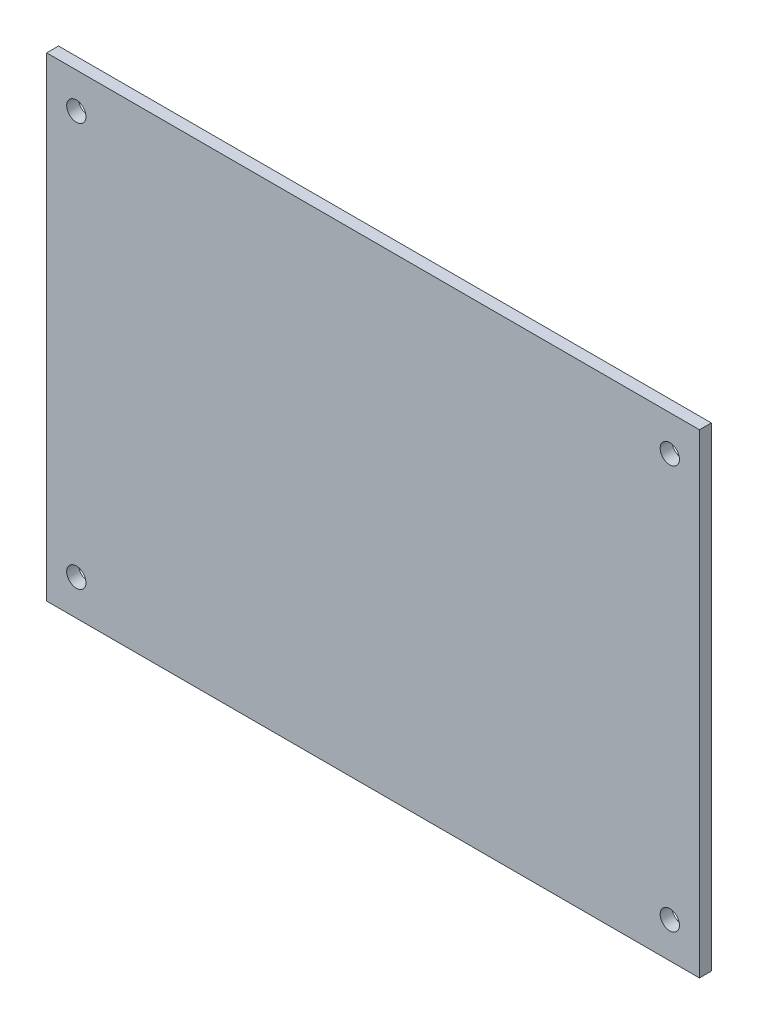
ISO-10303-21;
HEADER;
FILE_DESCRIPTION(('STEP AP214'),'2;1');
FILE_NAME('part.step','',(''),(''),'','','');
FILE_SCHEMA(('AUTOMOTIVE_DESIGN { 1 0 10303 214 1 1 1 1 }'));
ENDSEC;
DATA;
#1=APPLICATION_CONTEXT('core data for automotive mechanical design processes');
#2=APPLICATION_PROTOCOL_DEFINITION('international standard','automotive_design',2000,#1);
#3=PRODUCT_CONTEXT('',#1,'mechanical');
#4=PRODUCT('Part','Part','',(#3));
#5=PRODUCT_RELATED_PRODUCT_CATEGORY('part','',(#4));
#6=PRODUCT_DEFINITION_FORMATION('','',#4);
#7=PRODUCT_DEFINITION_CONTEXT('part definition',#1,'design');
#8=PRODUCT_DEFINITION('design','',#6,#7);
#9=PRODUCT_DEFINITION_SHAPE('','',#8);
#10=(LENGTH_UNIT() NAMED_UNIT(*) SI_UNIT(.MILLI.,.METRE.));
#11=(NAMED_UNIT(*) PLANE_ANGLE_UNIT() SI_UNIT($,.RADIAN.));
#12=(NAMED_UNIT(*) SI_UNIT($,.STERADIAN.) SOLID_ANGLE_UNIT());
#13=UNCERTAINTY_MEASURE_WITH_UNIT(LENGTH_MEASURE(1.E-05),#10,'distance_accuracy_value','');
#14=(GEOMETRIC_REPRESENTATION_CONTEXT(3) GLOBAL_UNCERTAINTY_ASSIGNED_CONTEXT((#13)) GLOBAL_UNIT_ASSIGNED_CONTEXT((#10,
#11,#12)) REPRESENTATION_CONTEXT('',''));
#15=CARTESIAN_POINT('',(0.,0.,0.));
#16=DIRECTION('',(0.,0.,1.));
#17=DIRECTION('',(1.,0.,0.));
#18=AXIS2_PLACEMENT_3D('',#15,#16,#17);
#19=CARTESIAN_POINT('',(55.,40.,-2.));
#20=DIRECTION('',(1.,0.,0.));
#21=DIRECTION('',(0.,1.,0.));
#22=AXIS2_PLACEMENT_3D('',#19,#20,#21);
#23=PLANE('',#22);
#24=DIRECTION('',(0.,1.,0.));
#25=VECTOR('',#24,1.);
#26=CARTESIAN_POINT('',(55.,40.,0.));
#27=LINE('',#26,#25);
#28=CARTESIAN_POINT('',(55.,-40.,0.));
#29=VERTEX_POINT('',#28);
#30=CARTESIAN_POINT('',(55.,40.,0.));
#31=VERTEX_POINT('',#30);
#32=EDGE_CURVE('E97',#29,#31,#27,.T.);
#33=ORIENTED_EDGE('',*,*,#32,.F.);
#34=DIRECTION('',(0.,0.,1.));
#35=VECTOR('',#34,1.);
#36=CARTESIAN_POINT('',(55.,-40.,-2.));
#37=LINE('',#36,#35);
#38=CARTESIAN_POINT('',(55.,-40.,-2.));
#39=VERTEX_POINT('',#38);
#40=EDGE_CURVE('E11',#39,#29,#37,.T.);
#41=ORIENTED_EDGE('',*,*,#40,.F.);
#42=DIRECTION('',(0.,1.,0.));
#43=VECTOR('',#42,1.);
#44=CARTESIAN_POINT('',(55.,40.,-2.));
#45=LINE('',#44,#43);
#46=CARTESIAN_POINT('',(55.,40.,-2.));
#47=VERTEX_POINT('',#46);
#48=EDGE_CURVE('E90',#39,#47,#45,.T.);
#49=ORIENTED_EDGE('',*,*,#48,.T.);
#50=DIRECTION('',(0.,0.,1.));
#51=VECTOR('',#50,1.);
#52=CARTESIAN_POINT('',(55.,40.,-2.));
#53=LINE('',#52,#51);
#54=EDGE_CURVE('E35',#47,#31,#53,.T.);
#55=ORIENTED_EDGE('',*,*,#54,.T.);
#56=EDGE_LOOP('',(#33,#41,#49,#55));
#57=FACE_BOUND('',#56,.T.);
#58=ADVANCED_FACE('F32',(#57),#23,.T.);
#59=CARTESIAN_POINT('',(-55.,-40.,-2.));
#60=DIRECTION('',(0.,-1.,0.));
#61=DIRECTION('',(0.,0.,-1.));
#62=AXIS2_PLACEMENT_3D('',#59,#60,#61);
#63=PLANE('',#62);
#64=DIRECTION('',(1.,0.,0.));
#65=VECTOR('',#64,1.);
#66=CARTESIAN_POINT('',(-55.,-40.,0.));
#67=LINE('',#66,#65);
#68=CARTESIAN_POINT('',(-55.,-40.,0.));
#69=VERTEX_POINT('',#68);
#70=EDGE_CURVE('E92',#69,#29,#67,.T.);
#71=ORIENTED_EDGE('',*,*,#70,.F.);
#72=DIRECTION('',(0.,0.,1.));
#73=VECTOR('',#72,1.);
#74=CARTESIAN_POINT('',(-55.,-40.,-2.));
#75=LINE('',#74,#73);
#76=CARTESIAN_POINT('',(-55.,-40.,-2.));
#77=VERTEX_POINT('',#76);
#78=EDGE_CURVE('E41',#77,#69,#75,.T.);
#79=ORIENTED_EDGE('',*,*,#78,.F.);
#80=DIRECTION('',(1.,0.,0.));
#81=VECTOR('',#80,1.);
#82=CARTESIAN_POINT('',(-55.,-40.,-2.));
#83=LINE('',#82,#81);
#84=EDGE_CURVE('E87',#77,#39,#83,.T.);
#85=ORIENTED_EDGE('',*,*,#84,.T.);
#86=ORIENTED_EDGE('',*,*,#40,.T.);
#87=EDGE_LOOP('',(#71,#79,#85,#86));
#88=FACE_BOUND('',#87,.T.);
#89=ADVANCED_FACE('F108',(#88),#63,.T.);
#90=CARTESIAN_POINT('',(-55.,40.,-2.));
#91=DIRECTION('',(-1.,0.,0.));
#92=DIRECTION('',(0.,-1.,0.));
#93=AXIS2_PLACEMENT_3D('',#90,#91,#92);
#94=PLANE('',#93);
#95=DIRECTION('',(0.,-1.,0.));
#96=VECTOR('',#95,1.);
#97=CARTESIAN_POINT('',(-55.,40.,0.));
#98=LINE('',#97,#96);
#99=CARTESIAN_POINT('',(-55.,40.,0.));
#100=VERTEX_POINT('',#99);
#101=EDGE_CURVE('E82',#100,#69,#98,.T.);
#102=ORIENTED_EDGE('',*,*,#101,.F.);
#103=DIRECTION('',(0.,0.,1.));
#104=VECTOR('',#103,1.);
#105=CARTESIAN_POINT('',(-55.,40.,-2.));
#106=LINE('',#105,#104);
#107=CARTESIAN_POINT('',(-55.,40.,-2.));
#108=VERTEX_POINT('',#107);
#109=EDGE_CURVE('E77',#108,#100,#106,.T.);
#110=ORIENTED_EDGE('',*,*,#109,.F.);
#111=DIRECTION('',(0.,-1.,0.));
#112=VECTOR('',#111,1.);
#113=CARTESIAN_POINT('',(-55.,40.,-2.));
#114=LINE('',#113,#112);
#115=EDGE_CURVE('E80',#108,#77,#114,.T.);
#116=ORIENTED_EDGE('',*,*,#115,.T.);
#117=ORIENTED_EDGE('',*,*,#78,.T.);
#118=EDGE_LOOP('',(#102,#110,#116,#117));
#119=FACE_BOUND('',#118,.T.);
#120=ADVANCED_FACE('F79',(#119),#94,.T.);
#121=CARTESIAN_POINT('',(-55.,40.,-2.));
#122=DIRECTION('',(0.,1.,0.));
#123=DIRECTION('',(0.,0.,1.));
#124=AXIS2_PLACEMENT_3D('',#121,#122,#123);
#125=PLANE('',#124);
#126=DIRECTION('',(-1.,0.,0.));
#127=VECTOR('',#126,1.);
#128=CARTESIAN_POINT('',(-55.,40.,0.));
#129=LINE('',#128,#127);
#130=EDGE_CURVE('E100',#31,#100,#129,.T.);
#131=ORIENTED_EDGE('',*,*,#130,.F.);
#132=ORIENTED_EDGE('',*,*,#54,.F.);
#133=DIRECTION('',(-1.,0.,0.));
#134=VECTOR('',#133,1.);
#135=CARTESIAN_POINT('',(-55.,40.,-2.));
#136=LINE('',#135,#134);
#137=EDGE_CURVE('E86',#47,#108,#136,.T.);
#138=ORIENTED_EDGE('',*,*,#137,.T.);
#139=ORIENTED_EDGE('',*,*,#109,.T.);
#140=EDGE_LOOP('',(#131,#132,#138,#139));
#141=FACE_BOUND('',#140,.T.);
#142=ADVANCED_FACE('F89',(#141),#125,.T.);
#143=CARTESIAN_POINT('',(0.,0.,-2.));
#144=DIRECTION('',(0.,0.,1.));
#145=DIRECTION('',(1.,0.,0.));
#146=AXIS2_PLACEMENT_3D('',#143,#144,#145);
#147=PLANE('',#146);
#148=CARTESIAN_POINT('',(-50.,-34.,-2.));
#149=DIRECTION('',(0.,0.,1.));
#150=DIRECTION('',(-1.,0.,0.));
#151=AXIS2_PLACEMENT_3D('',#148,#149,#150);
#152=CIRCLE('',#151,1.62463300813969);
#153=CARTESIAN_POINT('',(-51.6246330081397,-34.,-2.));
#154=VERTEX_POINT('',#153);
#155=EDGE_CURVE('E149',#154,#154,#152,.T.);
#156=ORIENTED_EDGE('',*,*,#155,.T.);
#157=EDGE_LOOP('',(#156));
#158=FACE_BOUND('',#157,.T.);
#159=CARTESIAN_POINT('',(50.,-34.,-2.));
#160=DIRECTION('',(0.,0.,1.));
#161=DIRECTION('',(1.,0.,0.));
#162=AXIS2_PLACEMENT_3D('',#159,#160,#161);
#163=CIRCLE('',#162,1.62463300813969);
#164=CARTESIAN_POINT('',(51.6246330081397,-34.,-2.));
#165=VERTEX_POINT('',#164);
#166=EDGE_CURVE('E157',#165,#165,#163,.T.);
#167=ORIENTED_EDGE('',*,*,#166,.T.);
#168=EDGE_LOOP('',(#167));
#169=FACE_BOUND('',#168,.T.);
#170=CARTESIAN_POINT('',(50.,34.,-2.));
#171=DIRECTION('',(0.,0.,1.));
#172=DIRECTION('',(-1.,0.,0.));
#173=AXIS2_PLACEMENT_3D('',#170,#171,#172);
#174=CIRCLE('',#173,1.62463300813969);
#175=CARTESIAN_POINT('',(48.3753669918603,34.,-2.));
#176=VERTEX_POINT('',#175);
#177=EDGE_CURVE('E163',#176,#176,#174,.T.);
#178=ORIENTED_EDGE('',*,*,#177,.T.);
#179=EDGE_LOOP('',(#178));
#180=FACE_BOUND('',#179,.T.);
#181=CARTESIAN_POINT('',(-50.,34.,-2.));
#182=DIRECTION('',(0.,0.,1.));
#183=DIRECTION('',(1.,0.,0.));
#184=AXIS2_PLACEMENT_3D('',#181,#182,#183);
#185=CIRCLE('',#184,1.62463300813969);
#186=CARTESIAN_POINT('',(-48.3753669918603,34.,-2.));
#187=VERTEX_POINT('',#186);
#188=EDGE_CURVE('E101',#187,#187,#185,.T.);
#189=ORIENTED_EDGE('',*,*,#188,.T.);
#190=EDGE_LOOP('',(#189));
#191=FACE_BOUND('',#190,.T.);
#192=ORIENTED_EDGE('',*,*,#48,.F.);
#193=ORIENTED_EDGE('',*,*,#84,.F.);
#194=ORIENTED_EDGE('',*,*,#115,.F.);
#195=ORIENTED_EDGE('',*,*,#137,.F.);
#196=EDGE_LOOP('',(#192,#193,#194,#195));
#197=FACE_BOUND('',#196,.T.);
#198=ADVANCED_FACE('F85',(#158,#169,#180,#191,#197),#147,.F.);
#199=CARTESIAN_POINT('',(0.,0.,0.));
#200=DIRECTION('',(0.,0.,1.));
#201=DIRECTION('',(1.,0.,0.));
#202=AXIS2_PLACEMENT_3D('',#199,#200,#201);
#203=PLANE('',#202);
#204=CARTESIAN_POINT('',(-50.,-34.,0.));
#205=DIRECTION('',(0.,0.,1.));
#206=DIRECTION('',(-1.,0.,0.));
#207=AXIS2_PLACEMENT_3D('',#204,#205,#206);
#208=CIRCLE('',#207,1.62463300813969);
#209=CARTESIAN_POINT('',(-51.6246330081397,-34.,0.));
#210=VERTEX_POINT('',#209);
#211=EDGE_CURVE('E152',#210,#210,#208,.T.);
#212=ORIENTED_EDGE('',*,*,#211,.F.);
#213=EDGE_LOOP('',(#212));
#214=FACE_BOUND('',#213,.T.);
#215=CARTESIAN_POINT('',(50.,-34.,0.));
#216=DIRECTION('',(0.,0.,1.));
#217=DIRECTION('',(1.,0.,0.));
#218=AXIS2_PLACEMENT_3D('',#215,#216,#217);
#219=CIRCLE('',#218,1.62463300813969);
#220=CARTESIAN_POINT('',(51.6246330081397,-34.,0.));
#221=VERTEX_POINT('',#220);
#222=EDGE_CURVE('E154',#221,#221,#219,.T.);
#223=ORIENTED_EDGE('',*,*,#222,.F.);
#224=EDGE_LOOP('',(#223));
#225=FACE_BOUND('',#224,.T.);
#226=CARTESIAN_POINT('',(50.,34.,0.));
#227=DIRECTION('',(0.,0.,1.));
#228=DIRECTION('',(-1.,0.,0.));
#229=AXIS2_PLACEMENT_3D('',#226,#227,#228);
#230=CIRCLE('',#229,1.62463300813969);
#231=CARTESIAN_POINT('',(48.3753669918603,34.,0.));
#232=VERTEX_POINT('',#231);
#233=EDGE_CURVE('E160',#232,#232,#230,.T.);
#234=ORIENTED_EDGE('',*,*,#233,.F.);
#235=EDGE_LOOP('',(#234));
#236=FACE_BOUND('',#235,.T.);
#237=CARTESIAN_POINT('',(-50.,34.,0.));
#238=DIRECTION('',(0.,0.,1.));
#239=DIRECTION('',(1.,0.,0.));
#240=AXIS2_PLACEMENT_3D('',#237,#238,#239);
#241=CIRCLE('',#240,1.62463300813969);
#242=CARTESIAN_POINT('',(-48.3753669918603,34.,0.));
#243=VERTEX_POINT('',#242);
#244=EDGE_CURVE('E166',#243,#243,#241,.T.);
#245=ORIENTED_EDGE('',*,*,#244,.F.);
#246=EDGE_LOOP('',(#245));
#247=FACE_BOUND('',#246,.T.);
#248=ORIENTED_EDGE('',*,*,#32,.T.);
#249=ORIENTED_EDGE('',*,*,#130,.T.);
#250=ORIENTED_EDGE('',*,*,#101,.T.);
#251=ORIENTED_EDGE('',*,*,#70,.T.);
#252=EDGE_LOOP('',(#248,#249,#250,#251));
#253=FACE_BOUND('',#252,.T.);
#254=ADVANCED_FACE('F107',(#214,#225,#236,#247,#253),#203,.T.);
#255=CARTESIAN_POINT('',(-50.,34.,-2.));
#256=DIRECTION('',(0.,0.,1.));
#257=DIRECTION('',(1.,0.,0.));
#258=AXIS2_PLACEMENT_3D('',#255,#256,#257);
#259=CYLINDRICAL_SURFACE('',#258,1.62463300813969);
#260=ORIENTED_EDGE('',*,*,#188,.F.);
#261=EDGE_LOOP('',(#260));
#262=FACE_BOUND('',#261,.T.);
#263=ORIENTED_EDGE('',*,*,#244,.T.);
#264=EDGE_LOOP('',(#263));
#265=FACE_BOUND('',#264,.T.);
#266=ADVANCED_FACE('F126',(#262,#265),#259,.F.);
#267=CARTESIAN_POINT('',(50.,34.,-2.));
#268=DIRECTION('',(0.,0.,1.));
#269=DIRECTION('',(1.,0.,0.));
#270=AXIS2_PLACEMENT_3D('',#267,#268,#269);
#271=CYLINDRICAL_SURFACE('',#270,1.62463300813969);
#272=ORIENTED_EDGE('',*,*,#177,.F.);
#273=EDGE_LOOP('',(#272));
#274=FACE_BOUND('',#273,.T.);
#275=ORIENTED_EDGE('',*,*,#233,.T.);
#276=EDGE_LOOP('',(#275));
#277=FACE_BOUND('',#276,.T.);
#278=ADVANCED_FACE('F133',(#274,#277),#271,.F.);
#279=CARTESIAN_POINT('',(50.,-34.,-2.));
#280=DIRECTION('',(0.,0.,1.));
#281=DIRECTION('',(1.,0.,0.));
#282=AXIS2_PLACEMENT_3D('',#279,#280,#281);
#283=CYLINDRICAL_SURFACE('',#282,1.62463300813969);
#284=ORIENTED_EDGE('',*,*,#166,.F.);
#285=EDGE_LOOP('',(#284));
#286=FACE_BOUND('',#285,.T.);
#287=ORIENTED_EDGE('',*,*,#222,.T.);
#288=EDGE_LOOP('',(#287));
#289=FACE_BOUND('',#288,.T.);
#290=ADVANCED_FACE('F137',(#286,#289),#283,.F.);
#291=CARTESIAN_POINT('',(-50.,-34.,-2.));
#292=DIRECTION('',(0.,0.,1.));
#293=DIRECTION('',(1.,0.,0.));
#294=AXIS2_PLACEMENT_3D('',#291,#292,#293);
#295=CYLINDRICAL_SURFACE('',#294,1.62463300813969);
#296=ORIENTED_EDGE('',*,*,#155,.F.);
#297=EDGE_LOOP('',(#296));
#298=FACE_BOUND('',#297,.T.);
#299=ORIENTED_EDGE('',*,*,#211,.T.);
#300=EDGE_LOOP('',(#299));
#301=FACE_BOUND('',#300,.T.);
#302=ADVANCED_FACE('F141',(#298,#301),#295,.F.);
#303=CLOSED_SHELL('',(#58,#89,#120,#142,#198,#254,#266,#278,#290,#302));
#304=MANIFOLD_SOLID_BREP('B2',#303);
#305=ADVANCED_BREP_SHAPE_REPRESENTATION('',(#18,#304),#14);
#306=SHAPE_DEFINITION_REPRESENTATION(#9,#305);
ENDSEC;
END-ISO-10303-21;
